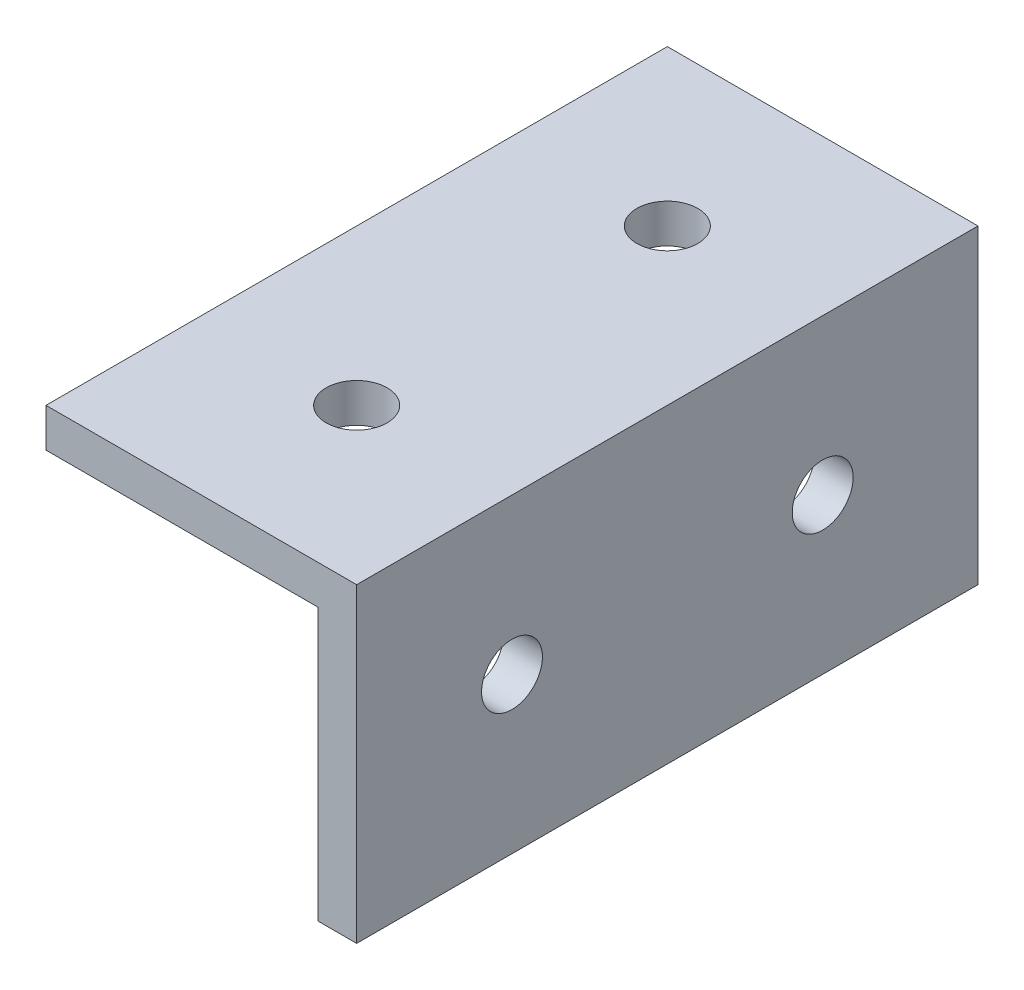
ISO-10303-21;
HEADER;
FILE_DESCRIPTION(('STEP AP214'),'2;1');
FILE_NAME('part.step','',(''),(''),'','','');
FILE_SCHEMA(('AUTOMOTIVE_DESIGN { 1 0 10303 214 1 1 1 1 }'));
ENDSEC;
DATA;
#1=APPLICATION_CONTEXT('core data for automotive mechanical design processes');
#2=APPLICATION_PROTOCOL_DEFINITION('international standard','automotive_design',2000,#1);
#3=PRODUCT_CONTEXT('',#1,'mechanical');
#4=PRODUCT('Part','Part','',(#3));
#5=PRODUCT_RELATED_PRODUCT_CATEGORY('part','',(#4));
#6=PRODUCT_DEFINITION_FORMATION('','',#4);
#7=PRODUCT_DEFINITION_CONTEXT('part definition',#1,'design');
#8=PRODUCT_DEFINITION('design','',#6,#7);
#9=PRODUCT_DEFINITION_SHAPE('','',#8);
#10=(LENGTH_UNIT() NAMED_UNIT(*) SI_UNIT(.MILLI.,.METRE.));
#11=(NAMED_UNIT(*) PLANE_ANGLE_UNIT() SI_UNIT($,.RADIAN.));
#12=(NAMED_UNIT(*) SI_UNIT($,.STERADIAN.) SOLID_ANGLE_UNIT());
#13=UNCERTAINTY_MEASURE_WITH_UNIT(LENGTH_MEASURE(1.E-05),#10,'distance_accuracy_value','');
#14=(GEOMETRIC_REPRESENTATION_CONTEXT(3) GLOBAL_UNCERTAINTY_ASSIGNED_CONTEXT((#13)) GLOBAL_UNIT_ASSIGNED_CONTEXT((#10,
#11,#12)) REPRESENTATION_CONTEXT('',''));
#15=CARTESIAN_POINT('',(0.,0.,0.));
#16=DIRECTION('',(0.,0.,1.));
#17=DIRECTION('',(1.,0.,0.));
#18=AXIS2_PLACEMENT_3D('',#15,#16,#17);
#19=CARTESIAN_POINT('',(-12.7,9.525,50.8));
#20=DIRECTION('',(1.,0.,0.));
#21=DIRECTION('',(0.,0.,-1.));
#22=AXIS2_PLACEMENT_3D('',#19,#20,#21);
#23=PLANE('',#22);
#24=DIRECTION('',(0.,-1.,0.));
#25=VECTOR('',#24,1.);
#26=CARTESIAN_POINT('',(-12.7,9.525,0.));
#27=LINE('',#26,#25);
#28=CARTESIAN_POINT('',(-12.7,12.7,0.));
#29=VERTEX_POINT('',#28);
#30=CARTESIAN_POINT('',(-12.7,9.525,0.));
#31=VERTEX_POINT('',#30);
#32=EDGE_CURVE('E134',#29,#31,#27,.T.);
#33=ORIENTED_EDGE('',*,*,#32,.T.);
#34=DIRECTION('',(0.,0.,-1.));
#35=VECTOR('',#34,1.);
#36=CARTESIAN_POINT('',(-12.7,9.525,50.8));
#37=LINE('',#36,#35);
#38=CARTESIAN_POINT('',(-12.7,9.525,50.8));
#39=VERTEX_POINT('',#38);
#40=EDGE_CURVE('E11',#39,#31,#37,.T.);
#41=ORIENTED_EDGE('',*,*,#40,.F.);
#42=DIRECTION('',(0.,-1.,0.));
#43=VECTOR('',#42,1.);
#44=CARTESIAN_POINT('',(-12.7,9.525,50.8));
#45=LINE('',#44,#43);
#46=CARTESIAN_POINT('',(-12.7,12.7,50.8));
#47=VERTEX_POINT('',#46);
#48=EDGE_CURVE('E151',#47,#39,#45,.T.);
#49=ORIENTED_EDGE('',*,*,#48,.F.);
#50=DIRECTION('',(0.,0.,-1.));
#51=VECTOR('',#50,1.);
#52=CARTESIAN_POINT('',(-12.7,12.7,50.8));
#53=LINE('',#52,#51);
#54=EDGE_CURVE('E130',#47,#29,#53,.T.);
#55=ORIENTED_EDGE('',*,*,#54,.T.);
#56=EDGE_LOOP('',(#33,#41,#49,#55));
#57=FACE_BOUND('',#56,.T.);
#58=ADVANCED_FACE('F45',(#57),#23,.F.);
#59=CARTESIAN_POINT('',(9.525,9.525,50.8));
#60=DIRECTION('',(0.,1.,0.));
#61=DIRECTION('',(0.,0.,1.));
#62=AXIS2_PLACEMENT_3D('',#59,#60,#61);
#63=PLANE('',#62);
#64=CARTESIAN_POINT('',(0.,9.525,38.1));
#65=DIRECTION('',(0.,1.,0.));
#66=DIRECTION('',(0.,0.,1.));
#67=AXIS2_PLACEMENT_3D('',#64,#65,#66);
#68=CIRCLE('',#67,2.48919999999999);
#69=CARTESIAN_POINT('',(0.,9.525,40.5892));
#70=VERTEX_POINT('',#69);
#71=EDGE_CURVE('E280',#70,#70,#68,.T.);
#72=ORIENTED_EDGE('',*,*,#71,.T.);
#73=EDGE_LOOP('',(#72));
#74=FACE_BOUND('',#73,.T.);
#75=CARTESIAN_POINT('',(0.,9.525,12.7));
#76=DIRECTION('',(0.,1.,0.));
#77=DIRECTION('',(0.,0.,1.));
#78=AXIS2_PLACEMENT_3D('',#75,#76,#77);
#79=CIRCLE('',#78,2.48919999999999);
#80=CARTESIAN_POINT('',(0.,9.525,15.1892));
#81=VERTEX_POINT('',#80);
#82=EDGE_CURVE('E139',#81,#81,#79,.T.);
#83=ORIENTED_EDGE('',*,*,#82,.T.);
#84=EDGE_LOOP('',(#83));
#85=FACE_BOUND('',#84,.T.);
#86=DIRECTION('',(1.,0.,0.));
#87=VECTOR('',#86,1.);
#88=CARTESIAN_POINT('',(9.525,9.525,0.));
#89=LINE('',#88,#87);
#90=CARTESIAN_POINT('',(9.525,9.525,0.));
#91=VERTEX_POINT('',#90);
#92=EDGE_CURVE('E138',#31,#91,#89,.T.);
#93=ORIENTED_EDGE('',*,*,#92,.T.);
#94=DIRECTION('',(0.,0.,-1.));
#95=VECTOR('',#94,1.);
#96=CARTESIAN_POINT('',(9.525,9.525,50.8));
#97=LINE('',#96,#95);
#98=CARTESIAN_POINT('',(9.525,9.525,50.8));
#99=VERTEX_POINT('',#98);
#100=EDGE_CURVE('E54',#99,#91,#97,.T.);
#101=ORIENTED_EDGE('',*,*,#100,.F.);
#102=DIRECTION('',(1.,0.,0.));
#103=VECTOR('',#102,1.);
#104=CARTESIAN_POINT('',(9.525,9.525,50.8));
#105=LINE('',#104,#103);
#106=EDGE_CURVE('E99',#39,#99,#105,.T.);
#107=ORIENTED_EDGE('',*,*,#106,.F.);
#108=ORIENTED_EDGE('',*,*,#40,.T.);
#109=EDGE_LOOP('',(#93,#101,#107,#108));
#110=FACE_BOUND('',#109,.T.);
#111=ADVANCED_FACE('F185',(#74,#85,#110),#63,.F.);
#112=CARTESIAN_POINT('',(9.525,-12.7,50.8));
#113=DIRECTION('',(1.,0.,0.));
#114=DIRECTION('',(0.,0.,-1.));
#115=AXIS2_PLACEMENT_3D('',#112,#113,#114);
#116=PLANE('',#115);
#117=CARTESIAN_POINT('',(9.525,0.,38.1));
#118=DIRECTION('',(1.,0.,0.));
#119=DIRECTION('',(0.,0.,-1.));
#120=AXIS2_PLACEMENT_3D('',#117,#118,#119);
#121=CIRCLE('',#120,2.48919999999999);
#122=CARTESIAN_POINT('',(9.525,0.,35.6108));
#123=VERTEX_POINT('',#122);
#124=EDGE_CURVE('E262',#123,#123,#121,.T.);
#125=ORIENTED_EDGE('',*,*,#124,.T.);
#126=EDGE_LOOP('',(#125));
#127=FACE_BOUND('',#126,.T.);
#128=CARTESIAN_POINT('',(9.525,0.,12.7));
#129=DIRECTION('',(1.,0.,0.));
#130=DIRECTION('',(0.,0.,-1.));
#131=AXIS2_PLACEMENT_3D('',#128,#129,#130);
#132=CIRCLE('',#131,2.48919999999999);
#133=CARTESIAN_POINT('',(9.525,0.,10.2108));
#134=VERTEX_POINT('',#133);
#135=EDGE_CURVE('E269',#134,#134,#132,.T.);
#136=ORIENTED_EDGE('',*,*,#135,.T.);
#137=EDGE_LOOP('',(#136));
#138=FACE_BOUND('',#137,.T.);
#139=DIRECTION('',(0.,-1.,0.));
#140=VECTOR('',#139,1.);
#141=CARTESIAN_POINT('',(9.525,-12.7,0.));
#142=LINE('',#141,#140);
#143=CARTESIAN_POINT('',(9.525,-12.7,0.));
#144=VERTEX_POINT('',#143);
#145=EDGE_CURVE('E142',#91,#144,#142,.T.);
#146=ORIENTED_EDGE('',*,*,#145,.T.);
#147=DIRECTION('',(0.,0.,-1.));
#148=VECTOR('',#147,1.);
#149=CARTESIAN_POINT('',(9.525,-12.7,50.8));
#150=LINE('',#149,#148);
#151=CARTESIAN_POINT('',(9.525,-12.7,50.8));
#152=VERTEX_POINT('',#151);
#153=EDGE_CURVE('E123',#152,#144,#150,.T.);
#154=ORIENTED_EDGE('',*,*,#153,.F.);
#155=DIRECTION('',(0.,-1.,0.));
#156=VECTOR('',#155,1.);
#157=CARTESIAN_POINT('',(9.525,-12.7,50.8));
#158=LINE('',#157,#156);
#159=EDGE_CURVE('E112',#99,#152,#158,.T.);
#160=ORIENTED_EDGE('',*,*,#159,.F.);
#161=ORIENTED_EDGE('',*,*,#100,.T.);
#162=EDGE_LOOP('',(#146,#154,#160,#161));
#163=FACE_BOUND('',#162,.T.);
#164=ADVANCED_FACE('F161',(#127,#138,#163),#116,.F.);
#165=CARTESIAN_POINT('',(12.7,-12.7,50.8));
#166=DIRECTION('',(0.,1.,0.));
#167=DIRECTION('',(0.,0.,1.));
#168=AXIS2_PLACEMENT_3D('',#165,#166,#167);
#169=PLANE('',#168);
#170=DIRECTION('',(1.,0.,0.));
#171=VECTOR('',#170,1.);
#172=CARTESIAN_POINT('',(12.7,-12.7,0.));
#173=LINE('',#172,#171);
#174=CARTESIAN_POINT('',(12.7,-12.7,0.));
#175=VERTEX_POINT('',#174);
#176=EDGE_CURVE('E121',#144,#175,#173,.T.);
#177=ORIENTED_EDGE('',*,*,#176,.T.);
#178=DIRECTION('',(0.,0.,-1.));
#179=VECTOR('',#178,1.);
#180=CARTESIAN_POINT('',(12.7,-12.7,50.8));
#181=LINE('',#180,#179);
#182=CARTESIAN_POINT('',(12.7,-12.7,50.8));
#183=VERTEX_POINT('',#182);
#184=EDGE_CURVE('E118',#183,#175,#181,.T.);
#185=ORIENTED_EDGE('',*,*,#184,.F.);
#186=DIRECTION('',(1.,0.,0.));
#187=VECTOR('',#186,1.);
#188=CARTESIAN_POINT('',(12.7,-12.7,50.8));
#189=LINE('',#188,#187);
#190=EDGE_CURVE('E106',#152,#183,#189,.T.);
#191=ORIENTED_EDGE('',*,*,#190,.F.);
#192=ORIENTED_EDGE('',*,*,#153,.T.);
#193=EDGE_LOOP('',(#177,#185,#191,#192));
#194=FACE_BOUND('',#193,.T.);
#195=ADVANCED_FACE('F119',(#194),#169,.F.);
#196=CARTESIAN_POINT('',(12.7,12.7,50.8));
#197=DIRECTION('',(-1.,0.,0.));
#198=DIRECTION('',(0.,0.,1.));
#199=AXIS2_PLACEMENT_3D('',#196,#197,#198);
#200=PLANE('',#199);
#201=CARTESIAN_POINT('',(12.7,0.,38.1));
#202=DIRECTION('',(1.,0.,0.));
#203=DIRECTION('',(0.,0.,-1.));
#204=AXIS2_PLACEMENT_3D('',#201,#202,#203);
#205=CIRCLE('',#204,2.48919999999999);
#206=CARTESIAN_POINT('',(12.7,0.,35.6108));
#207=VERTEX_POINT('',#206);
#208=EDGE_CURVE('E259',#207,#207,#205,.T.);
#209=ORIENTED_EDGE('',*,*,#208,.F.);
#210=EDGE_LOOP('',(#209));
#211=FACE_BOUND('',#210,.T.);
#212=CARTESIAN_POINT('',(12.7,0.,12.7));
#213=DIRECTION('',(1.,0.,0.));
#214=DIRECTION('',(0.,0.,-1.));
#215=AXIS2_PLACEMENT_3D('',#212,#213,#214);
#216=CIRCLE('',#215,2.48919999999999);
#217=CARTESIAN_POINT('',(12.7,0.,10.2108));
#218=VERTEX_POINT('',#217);
#219=EDGE_CURVE('E264',#218,#218,#216,.T.);
#220=ORIENTED_EDGE('',*,*,#219,.F.);
#221=EDGE_LOOP('',(#220));
#222=FACE_BOUND('',#221,.T.);
#223=DIRECTION('',(0.,1.,0.));
#224=VECTOR('',#223,1.);
#225=CARTESIAN_POINT('',(12.7,12.7,0.));
#226=LINE('',#225,#224);
#227=CARTESIAN_POINT('',(12.7,12.7,0.));
#228=VERTEX_POINT('',#227);
#229=EDGE_CURVE('E85',#175,#228,#226,.T.);
#230=ORIENTED_EDGE('',*,*,#229,.T.);
#231=DIRECTION('',(0.,0.,-1.));
#232=VECTOR('',#231,1.);
#233=CARTESIAN_POINT('',(12.7,12.7,50.8));
#234=LINE('',#233,#232);
#235=CARTESIAN_POINT('',(12.7,12.7,50.8));
#236=VERTEX_POINT('',#235);
#237=EDGE_CURVE('E124',#236,#228,#234,.T.);
#238=ORIENTED_EDGE('',*,*,#237,.F.);
#239=DIRECTION('',(0.,1.,0.));
#240=VECTOR('',#239,1.);
#241=CARTESIAN_POINT('',(12.7,12.7,50.8));
#242=LINE('',#241,#240);
#243=EDGE_CURVE('E110',#183,#236,#242,.T.);
#244=ORIENTED_EDGE('',*,*,#243,.F.);
#245=ORIENTED_EDGE('',*,*,#184,.T.);
#246=EDGE_LOOP('',(#230,#238,#244,#245));
#247=FACE_BOUND('',#246,.T.);
#248=ADVANCED_FACE('F126',(#211,#222,#247),#200,.F.);
#249=CARTESIAN_POINT('',(-12.7,12.7,50.8));
#250=DIRECTION('',(0.,-1.,0.));
#251=DIRECTION('',(0.,0.,-1.));
#252=AXIS2_PLACEMENT_3D('',#249,#250,#251);
#253=PLANE('',#252);
#254=CARTESIAN_POINT('',(0.,12.7,38.1));
#255=DIRECTION('',(0.,1.,0.));
#256=DIRECTION('',(0.,0.,1.));
#257=AXIS2_PLACEMENT_3D('',#254,#255,#256);
#258=CIRCLE('',#257,2.48919999999999);
#259=CARTESIAN_POINT('',(0.,12.7,40.5892));
#260=VERTEX_POINT('',#259);
#261=EDGE_CURVE('E276',#260,#260,#258,.T.);
#262=ORIENTED_EDGE('',*,*,#261,.F.);
#263=EDGE_LOOP('',(#262));
#264=FACE_BOUND('',#263,.T.);
#265=CARTESIAN_POINT('',(0.,12.7,12.7));
#266=DIRECTION('',(0.,1.,0.));
#267=DIRECTION('',(0.,0.,1.));
#268=AXIS2_PLACEMENT_3D('',#265,#266,#267);
#269=CIRCLE('',#268,2.48919999999999);
#270=CARTESIAN_POINT('',(0.,12.7,15.1892));
#271=VERTEX_POINT('',#270);
#272=EDGE_CURVE('E283',#271,#271,#269,.T.);
#273=ORIENTED_EDGE('',*,*,#272,.F.);
#274=EDGE_LOOP('',(#273));
#275=FACE_BOUND('',#274,.T.);
#276=DIRECTION('',(-1.,0.,0.));
#277=VECTOR('',#276,1.);
#278=CARTESIAN_POINT('',(-12.7,12.7,0.));
#279=LINE('',#278,#277);
#280=EDGE_CURVE('E91',#228,#29,#279,.T.);
#281=ORIENTED_EDGE('',*,*,#280,.T.);
#282=ORIENTED_EDGE('',*,*,#54,.F.);
#283=DIRECTION('',(-1.,0.,0.));
#284=VECTOR('',#283,1.);
#285=CARTESIAN_POINT('',(-12.7,12.7,50.8));
#286=LINE('',#285,#284);
#287=EDGE_CURVE('E62',#236,#47,#286,.T.);
#288=ORIENTED_EDGE('',*,*,#287,.F.);
#289=ORIENTED_EDGE('',*,*,#237,.T.);
#290=EDGE_LOOP('',(#281,#282,#288,#289));
#291=FACE_BOUND('',#290,.T.);
#292=ADVANCED_FACE('F168',(#264,#275,#291),#253,.F.);
#293=CARTESIAN_POINT('',(0.,0.,50.8));
#294=DIRECTION('',(0.,0.,-1.));
#295=DIRECTION('',(-1.,0.,0.));
#296=AXIS2_PLACEMENT_3D('',#293,#294,#295);
#297=PLANE('',#296);
#298=ORIENTED_EDGE('',*,*,#48,.T.);
#299=ORIENTED_EDGE('',*,*,#106,.T.);
#300=ORIENTED_EDGE('',*,*,#159,.T.);
#301=ORIENTED_EDGE('',*,*,#190,.T.);
#302=ORIENTED_EDGE('',*,*,#243,.T.);
#303=ORIENTED_EDGE('',*,*,#287,.T.);
#304=EDGE_LOOP('',(#298,#299,#300,#301,#302,#303));
#305=FACE_BOUND('',#304,.T.);
#306=ADVANCED_FACE('F108',(#305),#297,.F.);
#307=CARTESIAN_POINT('',(0.,0.,0.));
#308=DIRECTION('',(0.,0.,-1.));
#309=DIRECTION('',(-1.,0.,0.));
#310=AXIS2_PLACEMENT_3D('',#307,#308,#309);
#311=PLANE('',#310);
#312=ORIENTED_EDGE('',*,*,#32,.F.);
#313=ORIENTED_EDGE('',*,*,#280,.F.);
#314=ORIENTED_EDGE('',*,*,#229,.F.);
#315=ORIENTED_EDGE('',*,*,#176,.F.);
#316=ORIENTED_EDGE('',*,*,#145,.F.);
#317=ORIENTED_EDGE('',*,*,#92,.F.);
#318=EDGE_LOOP('',(#312,#313,#314,#315,#316,#317));
#319=FACE_BOUND('',#318,.T.);
#320=ADVANCED_FACE('F164',(#319),#311,.T.);
#321=CARTESIAN_POINT('',(0.,12.7,12.7));
#322=DIRECTION('',(0.,1.,0.));
#323=DIRECTION('',(0.,0.,1.));
#324=AXIS2_PLACEMENT_3D('',#321,#322,#323);
#325=CYLINDRICAL_SURFACE('',#324,2.48919999999999);
#326=ORIENTED_EDGE('',*,*,#272,.T.);
#327=EDGE_LOOP('',(#326));
#328=FACE_BOUND('',#327,.T.);
#329=ORIENTED_EDGE('',*,*,#82,.F.);
#330=EDGE_LOOP('',(#329));
#331=FACE_BOUND('',#330,.T.);
#332=ADVANCED_FACE('F213',(#328,#331),#325,.F.);
#333=CARTESIAN_POINT('',(0.,12.7,38.1));
#334=DIRECTION('',(0.,1.,0.));
#335=DIRECTION('',(0.,0.,1.));
#336=AXIS2_PLACEMENT_3D('',#333,#334,#335);
#337=CYLINDRICAL_SURFACE('',#336,2.48919999999999);
#338=ORIENTED_EDGE('',*,*,#261,.T.);
#339=EDGE_LOOP('',(#338));
#340=FACE_BOUND('',#339,.T.);
#341=ORIENTED_EDGE('',*,*,#71,.F.);
#342=EDGE_LOOP('',(#341));
#343=FACE_BOUND('',#342,.T.);
#344=ADVANCED_FACE('F223',(#340,#343),#337,.F.);
#345=CARTESIAN_POINT('',(12.7,0.,12.7));
#346=DIRECTION('',(1.,0.,0.));
#347=DIRECTION('',(0.,0.,-1.));
#348=AXIS2_PLACEMENT_3D('',#345,#346,#347);
#349=CYLINDRICAL_SURFACE('',#348,2.48919999999999);
#350=ORIENTED_EDGE('',*,*,#219,.T.);
#351=EDGE_LOOP('',(#350));
#352=FACE_BOUND('',#351,.T.);
#353=ORIENTED_EDGE('',*,*,#135,.F.);
#354=EDGE_LOOP('',(#353));
#355=FACE_BOUND('',#354,.T.);
#356=ADVANCED_FACE('F233',(#352,#355),#349,.F.);
#357=CARTESIAN_POINT('',(12.7,0.,38.1));
#358=DIRECTION('',(1.,0.,0.));
#359=DIRECTION('',(0.,0.,-1.));
#360=AXIS2_PLACEMENT_3D('',#357,#358,#359);
#361=CYLINDRICAL_SURFACE('',#360,2.48919999999999);
#362=ORIENTED_EDGE('',*,*,#208,.T.);
#363=EDGE_LOOP('',(#362));
#364=FACE_BOUND('',#363,.T.);
#365=ORIENTED_EDGE('',*,*,#124,.F.);
#366=EDGE_LOOP('',(#365));
#367=FACE_BOUND('',#366,.T.);
#368=ADVANCED_FACE('F243',(#364,#367),#361,.F.);
#369=CLOSED_SHELL('',(#58,#111,#164,#195,#248,#292,#306,#320,#332,#344,#356,#368));
#370=MANIFOLD_SOLID_BREP('B2',#369);
#371=ADVANCED_BREP_SHAPE_REPRESENTATION('',(#18,#370),#14);
#372=SHAPE_DEFINITION_REPRESENTATION(#9,#371);
ENDSEC;
END-ISO-10303-21;
